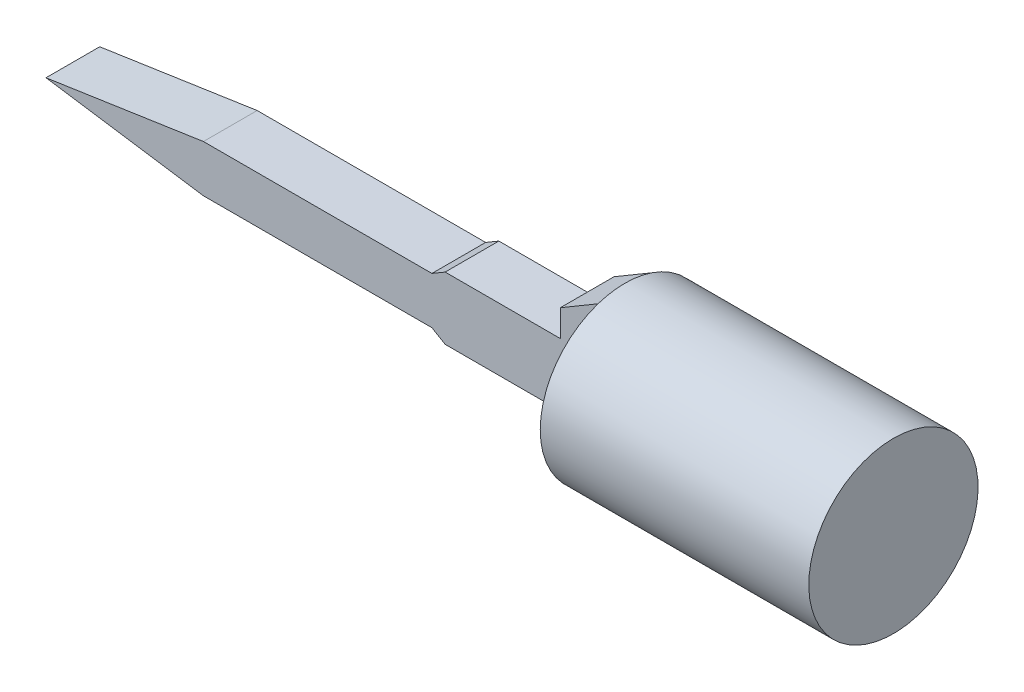
ISO-10303-21;
HEADER;
FILE_DESCRIPTION(('STEP AP214'),'2;1');
FILE_NAME('part.step','',(''),(''),'','','');
FILE_SCHEMA(('AUTOMOTIVE_DESIGN { 1 0 10303 214 1 1 1 1 }'));
ENDSEC;
DATA;
#1=APPLICATION_CONTEXT('core data for automotive mechanical design processes');
#2=APPLICATION_PROTOCOL_DEFINITION('international standard','automotive_design',2000,#1);
#3=PRODUCT_CONTEXT('',#1,'mechanical');
#4=PRODUCT('Part','Part','',(#3));
#5=PRODUCT_RELATED_PRODUCT_CATEGORY('part','',(#4));
#6=PRODUCT_DEFINITION_FORMATION('','',#4);
#7=PRODUCT_DEFINITION_CONTEXT('part definition',#1,'design');
#8=PRODUCT_DEFINITION('design','',#6,#7);
#9=PRODUCT_DEFINITION_SHAPE('','',#8);
#10=(LENGTH_UNIT() NAMED_UNIT(*) SI_UNIT(.MILLI.,.METRE.));
#11=(NAMED_UNIT(*) PLANE_ANGLE_UNIT() SI_UNIT($,.RADIAN.));
#12=(NAMED_UNIT(*) SI_UNIT($,.STERADIAN.) SOLID_ANGLE_UNIT());
#13=UNCERTAINTY_MEASURE_WITH_UNIT(LENGTH_MEASURE(1.E-05),#10,'distance_accuracy_value','');
#14=(GEOMETRIC_REPRESENTATION_CONTEXT(3) GLOBAL_UNCERTAINTY_ASSIGNED_CONTEXT((#13)) GLOBAL_UNIT_ASSIGNED_CONTEXT((#10,
#11,#12)) REPRESENTATION_CONTEXT('',''));
#15=CARTESIAN_POINT('',(0.,0.,0.));
#16=DIRECTION('',(0.,0.,1.));
#17=DIRECTION('',(1.,0.,0.));
#18=AXIS2_PLACEMENT_3D('',#15,#16,#17);
#19=CARTESIAN_POINT('',(0.,-41.5441578326383,20.));
#20=DIRECTION('',(0.,-1.,0.));
#21=DIRECTION('',(0.,0.,-1.));
#22=AXIS2_PLACEMENT_3D('',#19,#20,#21);
#23=PLANE('',#22);
#24=DIRECTION('',(-1.,0.,0.));
#25=VECTOR('',#24,1.);
#26=CARTESIAN_POINT('',(0.,-41.5441578326383,0.));
#27=LINE('',#26,#25);
#28=CARTESIAN_POINT('',(-74.0364069675786,-41.5441578326383,0.));
#29=VERTEX_POINT('',#28);
#30=CARTESIAN_POINT('',(-116.925428257402,-41.5441578326383,0.));
#31=VERTEX_POINT('',#30);
#32=EDGE_CURVE('E168',#29,#31,#27,.T.);
#33=ORIENTED_EDGE('',*,*,#32,.F.);
#34=DIRECTION('',(0.,0.,-1.));
#35=VECTOR('',#34,1.);
#36=CARTESIAN_POINT('',(-74.0364069675786,-41.5441578326383,20.));
#37=LINE('',#36,#35);
#38=CARTESIAN_POINT('',(-74.0364069675786,-41.5441578326383,20.));
#39=VERTEX_POINT('',#38);
#40=EDGE_CURVE('E11',#39,#29,#37,.T.);
#41=ORIENTED_EDGE('',*,*,#40,.F.);
#42=DIRECTION('',(-1.,0.,0.));
#43=VECTOR('',#42,1.);
#44=CARTESIAN_POINT('',(0.,-41.5441578326383,20.));
#45=LINE('',#44,#43);
#46=CARTESIAN_POINT('',(-116.925428257402,-41.5441578326383,20.));
#47=VERTEX_POINT('',#46);
#48=EDGE_CURVE('E213',#39,#47,#45,.T.);
#49=ORIENTED_EDGE('',*,*,#48,.T.);
#50=DIRECTION('',(0.,0.,-1.));
#51=VECTOR('',#50,1.);
#52=CARTESIAN_POINT('',(-116.925428257402,-41.5441578326383,20.));
#53=LINE('',#52,#51);
#54=EDGE_CURVE('E58',#47,#31,#53,.T.);
#55=ORIENTED_EDGE('',*,*,#54,.T.);
#56=EDGE_LOOP('',(#33,#41,#49,#55));
#57=FACE_BOUND('',#56,.T.);
#58=ADVANCED_FACE('F41',(#57),#23,.T.);
#59=CARTESIAN_POINT('',(-74.0364069675786,0.,20.));
#60=DIRECTION('',(1.,0.,0.));
#61=DIRECTION('',(0.,0.,-1.));
#62=AXIS2_PLACEMENT_3D('',#59,#60,#61);
#63=PLANE('',#62);
#64=DIRECTION('',(0.,-1.,0.));
#65=VECTOR('',#64,1.);
#66=CARTESIAN_POINT('',(-74.0364069675786,0.,0.));
#67=LINE('',#66,#65);
#68=CARTESIAN_POINT('',(-74.0364069675786,-51.4866127680065,0.));
#69=VERTEX_POINT('',#68);
#70=EDGE_CURVE('E171',#29,#69,#67,.T.);
#71=ORIENTED_EDGE('',*,*,#70,.T.);
#72=DIRECTION('',(0.,0.,-1.));
#73=VECTOR('',#72,1.);
#74=CARTESIAN_POINT('',(-74.0364069675786,-51.4866127680065,20.));
#75=LINE('',#74,#73);
#76=CARTESIAN_POINT('',(-74.0364069675786,-51.4866127680065,20.));
#77=VERTEX_POINT('',#76);
#78=EDGE_CURVE('E50',#77,#69,#75,.T.);
#79=ORIENTED_EDGE('',*,*,#78,.F.);
#80=DIRECTION('',(0.,-1.,0.));
#81=VECTOR('',#80,1.);
#82=CARTESIAN_POINT('',(-74.0364069675786,0.,20.));
#83=LINE('',#82,#81);
#84=EDGE_CURVE('E289',#39,#77,#83,.T.);
#85=ORIENTED_EDGE('',*,*,#84,.F.);
#86=ORIENTED_EDGE('',*,*,#40,.T.);
#87=EDGE_LOOP('',(#71,#79,#85,#86));
#88=FACE_BOUND('',#87,.T.);
#89=ADVANCED_FACE('F255',(#88),#63,.F.);
#90=CARTESIAN_POINT('',(-41.6690812424861,-70.5923258696236,20.));
#91=DIRECTION('',(-0.508326295281053,-0.861164547299667,0.));
#92=DIRECTION('',(0.861164547299667,-0.508326295281053,0.));
#93=AXIS2_PLACEMENT_3D('',#90,#91,#92);
#94=PLANE('',#93);
#95=DIRECTION('',(-0.861164547299667,0.508326295281053,0.));
#96=VECTOR('',#95,1.);
#97=CARTESIAN_POINT('',(-41.6690812424861,-70.5923258696236,0.));
#98=LINE('',#97,#96);
#99=CARTESIAN_POINT('',(-60.,-59.7719918808133,0.));
#100=VERTEX_POINT('',#99);
#101=EDGE_CURVE('E176',#100,#69,#98,.T.);
#102=ORIENTED_EDGE('',*,*,#101,.F.);
#103=DIRECTION('',(0.,0.,-1.));
#104=VECTOR('',#103,1.);
#105=CARTESIAN_POINT('',(-60.,-59.7719918808133,20.));
#106=LINE('',#105,#104);
#107=CARTESIAN_POINT('',(-60.,-59.7719918808133,20.));
#108=VERTEX_POINT('',#107);
#109=EDGE_CURVE('E242',#108,#100,#106,.T.);
#110=ORIENTED_EDGE('',*,*,#109,.F.);
#111=DIRECTION('',(-0.861164547299667,0.508326295281053,0.));
#112=VECTOR('',#111,1.);
#113=CARTESIAN_POINT('',(-41.6690812424861,-70.5923258696236,20.));
#114=LINE('',#113,#112);
#115=EDGE_CURVE('E252',#108,#77,#114,.T.);
#116=ORIENTED_EDGE('',*,*,#115,.T.);
#117=ORIENTED_EDGE('',*,*,#78,.T.);
#118=EDGE_LOOP('',(#102,#110,#116,#117));
#119=FACE_BOUND('',#118,.T.);
#120=ADVANCED_FACE('F250',(#119),#94,.T.);
#121=CARTESIAN_POINT('',(-15.5037373484495,26.2651550373734,20.));
#122=DIRECTION('',(0.508326295281051,-0.861164547299668,0.));
#123=DIRECTION('',(0.861164547299668,0.508326295281051,0.));
#124=AXIS2_PLACEMENT_3D('',#121,#122,#123);
#125=PLANE('',#124);
#126=DIRECTION('',(-0.861164547299668,-0.508326295281051,0.));
#127=VECTOR('',#126,1.);
#128=CARTESIAN_POINT('',(-15.5037373484495,26.2651550373734,0.));
#129=LINE('',#128,#127);
#130=CARTESIAN_POINT('',(-60.,0.,0.));
#131=VERTEX_POINT('',#130);
#132=CARTESIAN_POINT('',(-74.0364069675786,-8.28537911280683,0.));
#133=VERTEX_POINT('',#132);
#134=EDGE_CURVE('E184',#131,#133,#129,.T.);
#135=ORIENTED_EDGE('',*,*,#134,.T.);
#136=DIRECTION('',(0.,0.,-1.));
#137=VECTOR('',#136,1.);
#138=CARTESIAN_POINT('',(-74.0364069675786,-8.28537911280683,20.));
#139=LINE('',#138,#137);
#140=CARTESIAN_POINT('',(-74.0364069675786,-8.28537911280683,20.));
#141=VERTEX_POINT('',#140);
#142=EDGE_CURVE('E235',#141,#133,#139,.T.);
#143=ORIENTED_EDGE('',*,*,#142,.F.);
#144=DIRECTION('',(-0.861164547299668,-0.508326295281051,0.));
#145=VECTOR('',#144,1.);
#146=CARTESIAN_POINT('',(-15.5037373484495,26.2651550373734,20.));
#147=LINE('',#146,#145);
#148=CARTESIAN_POINT('',(-60.,0.,20.));
#149=VERTEX_POINT('',#148);
#150=EDGE_CURVE('E298',#149,#141,#147,.T.);
#151=ORIENTED_EDGE('',*,*,#150,.F.);
#152=DIRECTION('',(0.,0.,-1.));
#153=VECTOR('',#152,1.);
#154=CARTESIAN_POINT('',(-60.,0.,20.));
#155=LINE('',#154,#153);
#156=EDGE_CURVE('E239',#149,#131,#155,.T.);
#157=ORIENTED_EDGE('',*,*,#156,.T.);
#158=EDGE_LOOP('',(#135,#143,#151,#157));
#159=FACE_BOUND('',#158,.T.);
#160=ADVANCED_FACE('F335',(#159),#125,.F.);
#161=CARTESIAN_POINT('',(-74.0364069675786,0.,20.));
#162=DIRECTION('',(1.,0.,0.));
#163=DIRECTION('',(0.,0.,-1.));
#164=AXIS2_PLACEMENT_3D('',#161,#162,#163);
#165=PLANE('',#164);
#166=DIRECTION('',(0.,-1.,0.));
#167=VECTOR('',#166,1.);
#168=CARTESIAN_POINT('',(-74.0364069675786,0.,0.));
#169=LINE('',#168,#167);
#170=CARTESIAN_POINT('',(-74.0364069675786,-18.227834048175,0.));
#171=VERTEX_POINT('',#170);
#172=EDGE_CURVE('E187',#133,#171,#169,.T.);
#173=ORIENTED_EDGE('',*,*,#172,.T.);
#174=DIRECTION('',(0.,0.,-1.));
#175=VECTOR('',#174,1.);
#176=CARTESIAN_POINT('',(-74.0364069675786,-18.227834048175,20.));
#177=LINE('',#176,#175);
#178=CARTESIAN_POINT('',(-74.0364069675786,-18.227834048175,20.));
#179=VERTEX_POINT('',#178);
#180=EDGE_CURVE('E231',#179,#171,#177,.T.);
#181=ORIENTED_EDGE('',*,*,#180,.F.);
#182=DIRECTION('',(0.,-1.,0.));
#183=VECTOR('',#182,1.);
#184=CARTESIAN_POINT('',(-74.0364069675786,0.,20.));
#185=LINE('',#184,#183);
#186=EDGE_CURVE('E301',#141,#179,#185,.T.);
#187=ORIENTED_EDGE('',*,*,#186,.F.);
#188=ORIENTED_EDGE('',*,*,#142,.T.);
#189=EDGE_LOOP('',(#173,#181,#187,#188));
#190=FACE_BOUND('',#189,.T.);
#191=ADVANCED_FACE('F340',(#190),#165,.F.);
#192=CARTESIAN_POINT('',(0.,-18.227834048175,20.));
#193=DIRECTION('',(0.,-1.,0.));
#194=DIRECTION('',(0.,0.,-1.));
#195=AXIS2_PLACEMENT_3D('',#192,#193,#194);
#196=PLANE('',#195);
#197=DIRECTION('',(-1.,0.,0.));
#198=VECTOR('',#197,1.);
#199=CARTESIAN_POINT('',(0.,-18.227834048175,0.));
#200=LINE('',#199,#198);
#201=CARTESIAN_POINT('',(-116.925428257402,-18.227834048175,0.));
#202=VERTEX_POINT('',#201);
#203=EDGE_CURVE('E190',#171,#202,#200,.T.);
#204=ORIENTED_EDGE('',*,*,#203,.T.);
#205=DIRECTION('',(0.,0.,-1.));
#206=VECTOR('',#205,1.);
#207=CARTESIAN_POINT('',(-116.925428257402,-18.227834048175,20.));
#208=LINE('',#207,#206);
#209=CARTESIAN_POINT('',(-116.925428257402,-18.227834048175,20.));
#210=VERTEX_POINT('',#209);
#211=EDGE_CURVE('E227',#210,#202,#208,.T.);
#212=ORIENTED_EDGE('',*,*,#211,.F.);
#213=DIRECTION('',(-1.,0.,0.));
#214=VECTOR('',#213,1.);
#215=CARTESIAN_POINT('',(0.,-18.227834048175,20.));
#216=LINE('',#215,#214);
#217=EDGE_CURVE('E304',#179,#210,#216,.T.);
#218=ORIENTED_EDGE('',*,*,#217,.F.);
#219=ORIENTED_EDGE('',*,*,#180,.T.);
#220=EDGE_LOOP('',(#204,#212,#218,#219));
#221=FACE_BOUND('',#220,.T.);
#222=ADVANCED_FACE('F344',(#221),#196,.F.);
#223=CARTESIAN_POINT('',(-22.2337373631153,37.6665668269248,20.));
#224=DIRECTION('',(0.508326295281053,-0.861164547299667,0.));
#225=DIRECTION('',(0.861164547299667,0.508326295281053,0.));
#226=AXIS2_PLACEMENT_3D('',#223,#224,#225);
#227=PLANE('',#226);
#228=DIRECTION('',(-0.861164547299667,-0.508326295281053,0.));
#229=VECTOR('',#228,1.);
#230=CARTESIAN_POINT('',(-22.2337373631153,37.6665668269248,0.));
#231=LINE('',#230,#229);
#232=CARTESIAN_POINT('',(-121.846026987641,-21.1323541319965,0.));
#233=VERTEX_POINT('',#232);
#234=EDGE_CURVE('E193',#202,#233,#231,.T.);
#235=ORIENTED_EDGE('',*,*,#234,.T.);
#236=DIRECTION('',(0.,0.,-1.));
#237=VECTOR('',#236,1.);
#238=CARTESIAN_POINT('',(-121.846026987641,-21.1323541319965,20.));
#239=LINE('',#238,#237);
#240=CARTESIAN_POINT('',(-121.846026987641,-21.1323541319965,20.));
#241=VERTEX_POINT('',#240);
#242=EDGE_CURVE('E223',#241,#233,#239,.T.);
#243=ORIENTED_EDGE('',*,*,#242,.F.);
#244=DIRECTION('',(-0.861164547299667,-0.508326295281053,0.));
#245=VECTOR('',#244,1.);
#246=CARTESIAN_POINT('',(-22.2337373631153,37.6665668269248,20.));
#247=LINE('',#246,#245);
#248=EDGE_CURVE('E307',#210,#241,#247,.T.);
#249=ORIENTED_EDGE('',*,*,#248,.F.);
#250=ORIENTED_EDGE('',*,*,#211,.T.);
#251=EDGE_LOOP('',(#235,#243,#249,#250));
#252=FACE_BOUND('',#251,.T.);
#253=ADVANCED_FACE('F348',(#252),#227,.F.);
#254=CARTESIAN_POINT('',(0.,-21.1323541319965,20.));
#255=DIRECTION('',(0.,-1.,0.));
#256=DIRECTION('',(1.,0.,0.));
#257=AXIS2_PLACEMENT_3D('',#254,#255,#256);
#258=PLANE('',#257);
#259=DIRECTION('',(-1.,0.,0.));
#260=VECTOR('',#259,1.);
#261=CARTESIAN_POINT('',(0.,-21.1323541319965,0.));
#262=LINE('',#261,#260);
#263=CARTESIAN_POINT('',(-206.925428257402,-21.1323541319965,0.));
#264=VERTEX_POINT('',#263);
#265=EDGE_CURVE('E196',#233,#264,#262,.T.);
#266=ORIENTED_EDGE('',*,*,#265,.T.);
#267=DIRECTION('',(0.,0.,-1.));
#268=VECTOR('',#267,1.);
#269=CARTESIAN_POINT('',(-206.925428257402,-21.1323541319965,20.));
#270=LINE('',#269,#268);
#271=CARTESIAN_POINT('',(-206.925428257402,-21.1323541319965,20.));
#272=VERTEX_POINT('',#271);
#273=EDGE_CURVE('E220',#272,#264,#270,.T.);
#274=ORIENTED_EDGE('',*,*,#273,.F.);
#275=DIRECTION('',(-1.,0.,0.));
#276=VECTOR('',#275,1.);
#277=CARTESIAN_POINT('',(0.,-21.1323541319965,20.));
#278=LINE('',#277,#276);
#279=EDGE_CURVE('E310',#241,#272,#278,.T.);
#280=ORIENTED_EDGE('',*,*,#279,.F.);
#281=ORIENTED_EDGE('',*,*,#242,.T.);
#282=EDGE_LOOP('',(#266,#274,#280,#281));
#283=FACE_BOUND('',#282,.T.);
#284=ADVANCED_FACE('F352',(#283),#258,.F.);
#285=CARTESIAN_POINT('',(-1.42565164519436,9.54887183785221,20.));
#286=DIRECTION('',(-0.147663841023225,0.989037608008041,0.));
#287=DIRECTION('',(-0.989037608008041,-0.147663841023225,0.));
#288=AXIS2_PLACEMENT_3D('',#285,#286,#287);
#289=PLANE('',#288);
#290=DIRECTION('',(0.989037608008041,0.147663841023225,0.));
#291=VECTOR('',#290,1.);
#292=CARTESIAN_POINT('',(-1.42565164519436,9.54887183785221,0.));
#293=LINE('',#292,#291);
#294=CARTESIAN_POINT('',(-265.556443782641,-29.8859959404067,0.));
#295=VERTEX_POINT('',#294);
#296=EDGE_CURVE('E200',#295,#264,#293,.T.);
#297=ORIENTED_EDGE('',*,*,#296,.F.);
#298=DIRECTION('',(0.,0.,-1.));
#299=VECTOR('',#298,1.);
#300=CARTESIAN_POINT('',(-265.556443782641,-29.8859959404067,20.));
#301=LINE('',#300,#299);
#302=CARTESIAN_POINT('',(-265.556443782641,-29.8859959404067,20.));
#303=VERTEX_POINT('',#302);
#304=EDGE_CURVE('E158',#303,#295,#301,.T.);
#305=ORIENTED_EDGE('',*,*,#304,.F.);
#306=DIRECTION('',(0.989037608008041,0.147663841023225,0.));
#307=VECTOR('',#306,1.);
#308=CARTESIAN_POINT('',(-1.42565164519436,9.54887183785221,20.));
#309=LINE('',#308,#307);
#310=EDGE_CURVE('E146',#303,#272,#309,.T.);
#311=ORIENTED_EDGE('',*,*,#310,.T.);
#312=ORIENTED_EDGE('',*,*,#273,.T.);
#313=EDGE_LOOP('',(#297,#305,#311,#312));
#314=FACE_BOUND('',#313,.T.);
#315=ADVANCED_FACE('F315',(#314),#289,.T.);
#316=CARTESIAN_POINT('',(-10.1550577053182,-68.0175587500249,20.));
#317=DIRECTION('',(0.147663841023225,0.989037608008041,0.));
#318=DIRECTION('',(-0.989037608008041,0.147663841023225,0.));
#319=AXIS2_PLACEMENT_3D('',#316,#317,#318);
#320=PLANE('',#319);
#321=DIRECTION('',(0.989037608008041,-0.147663841023225,0.));
#322=VECTOR('',#321,1.);
#323=CARTESIAN_POINT('',(-10.1550577053182,-68.0175587500249,0.));
#324=LINE('',#323,#322);
#325=CARTESIAN_POINT('',(-206.925428257402,-38.6396377488168,0.));
#326=VERTEX_POINT('',#325);
#327=EDGE_CURVE('E154',#295,#326,#324,.T.);
#328=ORIENTED_EDGE('',*,*,#327,.T.);
#329=DIRECTION('',(0.,0.,-1.));
#330=VECTOR('',#329,1.);
#331=CARTESIAN_POINT('',(-206.925428257402,-38.6396377488168,20.));
#332=LINE('',#331,#330);
#333=CARTESIAN_POINT('',(-206.925428257402,-38.6396377488168,20.));
#334=VERTEX_POINT('',#333);
#335=EDGE_CURVE('E151',#334,#326,#332,.T.);
#336=ORIENTED_EDGE('',*,*,#335,.F.);
#337=DIRECTION('',(0.989037608008041,-0.147663841023225,0.));
#338=VECTOR('',#337,1.);
#339=CARTESIAN_POINT('',(-10.1550577053182,-68.0175587500249,20.));
#340=LINE('',#339,#338);
#341=EDGE_CURVE('E138',#303,#334,#340,.T.);
#342=ORIENTED_EDGE('',*,*,#341,.F.);
#343=ORIENTED_EDGE('',*,*,#304,.T.);
#344=EDGE_LOOP('',(#328,#336,#342,#343));
#345=FACE_BOUND('',#344,.T.);
#346=ADVANCED_FACE('F152',(#345),#320,.F.);
#347=CARTESIAN_POINT('',(0.,-38.6396377488168,20.));
#348=DIRECTION('',(0.,-1.,0.));
#349=DIRECTION('',(1.,0.,0.));
#350=AXIS2_PLACEMENT_3D('',#347,#348,#349);
#351=PLANE('',#350);
#352=DIRECTION('',(-1.,0.,0.));
#353=VECTOR('',#352,1.);
#354=CARTESIAN_POINT('',(0.,-38.6396377488168,0.));
#355=LINE('',#354,#353);
#356=CARTESIAN_POINT('',(-121.846026987641,-38.6396377488168,0.));
#357=VERTEX_POINT('',#356);
#358=EDGE_CURVE('E206',#357,#326,#355,.T.);
#359=ORIENTED_EDGE('',*,*,#358,.F.);
#360=DIRECTION('',(0.,0.,-1.));
#361=VECTOR('',#360,1.);
#362=CARTESIAN_POINT('',(-121.846026987641,-38.6396377488168,20.));
#363=LINE('',#362,#361);
#364=CARTESIAN_POINT('',(-121.846026987641,-38.6396377488168,20.));
#365=VERTEX_POINT('',#364);
#366=EDGE_CURVE('E96',#365,#357,#363,.T.);
#367=ORIENTED_EDGE('',*,*,#366,.F.);
#368=DIRECTION('',(-1.,0.,0.));
#369=VECTOR('',#368,1.);
#370=CARTESIAN_POINT('',(0.,-38.6396377488168,20.));
#371=LINE('',#370,#369);
#372=EDGE_CURVE('E144',#365,#334,#371,.T.);
#373=ORIENTED_EDGE('',*,*,#372,.T.);
#374=ORIENTED_EDGE('',*,*,#335,.T.);
#375=EDGE_LOOP('',(#359,#367,#373,#374));
#376=FACE_BOUND('',#375,.T.);
#377=ADVANCED_FACE('F160',(#376),#351,.T.);
#378=CARTESIAN_POINT('',(-48.3990812571518,-81.993737659175,20.));
#379=DIRECTION('',(-0.508326295281053,-0.861164547299667,0.));
#380=DIRECTION('',(0.861164547299667,-0.508326295281053,0.));
#381=AXIS2_PLACEMENT_3D('',#378,#379,#380);
#382=PLANE('',#381);
#383=DIRECTION('',(-0.861164547299667,0.508326295281053,0.));
#384=VECTOR('',#383,1.);
#385=CARTESIAN_POINT('',(-48.3990812571518,-81.993737659175,0.));
#386=LINE('',#385,#384);
#387=EDGE_CURVE('E209',#31,#357,#386,.T.);
#388=ORIENTED_EDGE('',*,*,#387,.F.);
#389=ORIENTED_EDGE('',*,*,#54,.F.);
#390=DIRECTION('',(-0.861164547299667,0.508326295281053,0.));
#391=VECTOR('',#390,1.);
#392=CARTESIAN_POINT('',(-48.3990812571518,-81.993737659175,20.));
#393=LINE('',#392,#391);
#394=EDGE_CURVE('E162',#47,#365,#393,.T.);
#395=ORIENTED_EDGE('',*,*,#394,.T.);
#396=ORIENTED_EDGE('',*,*,#366,.T.);
#397=EDGE_LOOP('',(#388,#389,#395,#396));
#398=FACE_BOUND('',#397,.T.);
#399=ADVANCED_FACE('F318',(#398),#382,.T.);
#400=CARTESIAN_POINT('',(0.,0.,20.));
#401=DIRECTION('',(0.,0.,1.));
#402=DIRECTION('',(1.,0.,0.));
#403=AXIS2_PLACEMENT_3D('',#400,#401,#402);
#404=PLANE('',#403);
#405=ORIENTED_EDGE('',*,*,#48,.F.);
#406=ORIENTED_EDGE('',*,*,#84,.T.);
#407=ORIENTED_EDGE('',*,*,#115,.F.);
#408=DIRECTION('',(0.,-1.,0.));
#409=VECTOR('',#408,1.);
#410=CARTESIAN_POINT('',(-60.,0.,20.));
#411=LINE('',#410,#409);
#412=EDGE_CURVE('E294',#149,#108,#411,.T.);
#413=ORIENTED_EDGE('',*,*,#412,.F.);
#414=ORIENTED_EDGE('',*,*,#150,.T.);
#415=ORIENTED_EDGE('',*,*,#186,.T.);
#416=ORIENTED_EDGE('',*,*,#217,.T.);
#417=ORIENTED_EDGE('',*,*,#248,.T.);
#418=ORIENTED_EDGE('',*,*,#279,.T.);
#419=ORIENTED_EDGE('',*,*,#310,.F.);
#420=ORIENTED_EDGE('',*,*,#341,.T.);
#421=ORIENTED_EDGE('',*,*,#372,.F.);
#422=ORIENTED_EDGE('',*,*,#394,.F.);
#423=EDGE_LOOP('',(#405,#406,#407,#413,#414,#415,#416,#417,#418,#419,#420,#421,#422));
#424=FACE_BOUND('',#423,.T.);
#425=ADVANCED_FACE('F141',(#424),#404,.T.);
#426=CARTESIAN_POINT('',(0.,0.,0.));
#427=DIRECTION('',(0.,0.,1.));
#428=DIRECTION('',(1.,0.,0.));
#429=AXIS2_PLACEMENT_3D('',#426,#427,#428);
#430=PLANE('',#429);
#431=ORIENTED_EDGE('',*,*,#32,.T.);
#432=ORIENTED_EDGE('',*,*,#387,.T.);
#433=ORIENTED_EDGE('',*,*,#358,.T.);
#434=ORIENTED_EDGE('',*,*,#327,.F.);
#435=ORIENTED_EDGE('',*,*,#296,.T.);
#436=ORIENTED_EDGE('',*,*,#265,.F.);
#437=ORIENTED_EDGE('',*,*,#234,.F.);
#438=ORIENTED_EDGE('',*,*,#203,.F.);
#439=ORIENTED_EDGE('',*,*,#172,.F.);
#440=ORIENTED_EDGE('',*,*,#134,.F.);
#441=DIRECTION('',(0.,-1.,0.));
#442=VECTOR('',#441,1.);
#443=CARTESIAN_POINT('',(-60.,0.,0.));
#444=LINE('',#443,#442);
#445=EDGE_CURVE('E180',#131,#100,#444,.T.);
#446=ORIENTED_EDGE('',*,*,#445,.T.);
#447=ORIENTED_EDGE('',*,*,#101,.T.);
#448=ORIENTED_EDGE('',*,*,#70,.F.);
#449=EDGE_LOOP('',(#431,#432,#433,#434,#435,#436,#437,#438,#439,#440,#446,#447,#448));
#450=FACE_BOUND('',#449,.T.);
#451=ADVANCED_FACE('F257',(#450),#430,.F.);
#452=CARTESIAN_POINT('',(-60.,-29.8859959404067,10.));
#453=DIRECTION('',(1.,0.,0.));
#454=DIRECTION('',(0.,1.,0.));
#455=AXIS2_PLACEMENT_3D('',#452,#453,#454);
#456=PLANE('',#455);
#457=ORIENTED_EDGE('',*,*,#445,.F.);
#458=CARTESIAN_POINT('',(-60.,-29.8859959404067,10.));
#459=DIRECTION('',(1.,0.,0.));
#460=DIRECTION('',(0.,1.,0.));
#461=AXIS2_PLACEMENT_3D('',#458,#459,#460);
#462=CIRCLE('',#461,31.5146434748991);
#463=EDGE_CURVE('E266',#100,#131,#462,.T.);
#464=ORIENTED_EDGE('',*,*,#463,.F.);
#465=EDGE_LOOP('',(#457,#464));
#466=FACE_BOUND('',#465,.T.);
#467=ADVANCED_FACE('F264',(#466),#456,.F.);
#468=ORIENTED_EDGE('',*,*,#156,.F.);
#469=EDGE_CURVE('E271',#131,#149,#462,.T.);
#470=ORIENTED_EDGE('',*,*,#469,.F.);
#471=EDGE_LOOP('',(#468,#470));
#472=FACE_BOUND('',#471,.T.);
#473=ADVANCED_FACE('F272',(#472),#456,.F.);
#474=EDGE_CURVE('E278',#149,#108,#462,.T.);
#475=ORIENTED_EDGE('',*,*,#474,.F.);
#476=ORIENTED_EDGE('',*,*,#412,.T.);
#477=EDGE_LOOP('',(#475,#476));
#478=FACE_BOUND('',#477,.T.);
#479=ADVANCED_FACE('F421',(#478),#456,.F.);
#480=CARTESIAN_POINT('',(40.,-29.8859959404067,10.));
#481=DIRECTION('',(-1.,0.,0.));
#482=DIRECTION('',(0.,-1.,0.));
#483=AXIS2_PLACEMENT_3D('',#480,#481,#482);
#484=CYLINDRICAL_SURFACE('',#483,31.5146434748991);
#485=CARTESIAN_POINT('',(40.,-29.8859959404067,10.));
#486=DIRECTION('',(1.,0.,0.));
#487=DIRECTION('',(0.,1.,0.));
#488=AXIS2_PLACEMENT_3D('',#485,#486,#487);
#489=CIRCLE('',#488,31.5146434748991);
#490=CARTESIAN_POINT('',(40.,1.62864753449243,10.));
#491=VERTEX_POINT('',#490);
#492=EDGE_CURVE('E172',#491,#491,#489,.T.);
#493=ORIENTED_EDGE('',*,*,#492,.F.);
#494=EDGE_LOOP('',(#493));
#495=FACE_BOUND('',#494,.T.);
#496=ORIENTED_EDGE('',*,*,#474,.T.);
#497=EDGE_CURVE('E281',#108,#100,#462,.T.);
#498=ORIENTED_EDGE('',*,*,#497,.T.);
#499=ORIENTED_EDGE('',*,*,#463,.T.);
#500=ORIENTED_EDGE('',*,*,#469,.T.);
#501=EDGE_LOOP('',(#496,#498,#499,#500));
#502=FACE_BOUND('',#501,.T.);
#503=ADVANCED_FACE('F279',(#495,#502),#484,.T.);
#504=CARTESIAN_POINT('',(40.,-29.8859959404067,10.));
#505=DIRECTION('',(1.,0.,0.));
#506=DIRECTION('',(0.,1.,0.));
#507=AXIS2_PLACEMENT_3D('',#504,#505,#506);
#508=PLANE('',#507);
#509=ORIENTED_EDGE('',*,*,#492,.T.);
#510=EDGE_LOOP('',(#509));
#511=FACE_BOUND('',#510,.T.);
#512=ADVANCED_FACE('F437',(#511),#508,.T.);
#513=ORIENTED_EDGE('',*,*,#497,.F.);
#514=ORIENTED_EDGE('',*,*,#109,.T.);
#515=EDGE_LOOP('',(#513,#514));
#516=FACE_BOUND('',#515,.T.);
#517=ADVANCED_FACE('F413',(#516),#456,.F.);
#518=CLOSED_SHELL('',(#58,#89,#120,#160,#191,#222,#253,#284,#315,#346,#377,#399,#425,#451,#467,
#473,#479,#503,#512,#517));
#519=MANIFOLD_SOLID_BREP('B2',#518);
#520=ADVANCED_BREP_SHAPE_REPRESENTATION('',(#18,#519),#14);
#521=SHAPE_DEFINITION_REPRESENTATION(#9,#520);
ENDSEC;
END-ISO-10303-21;
